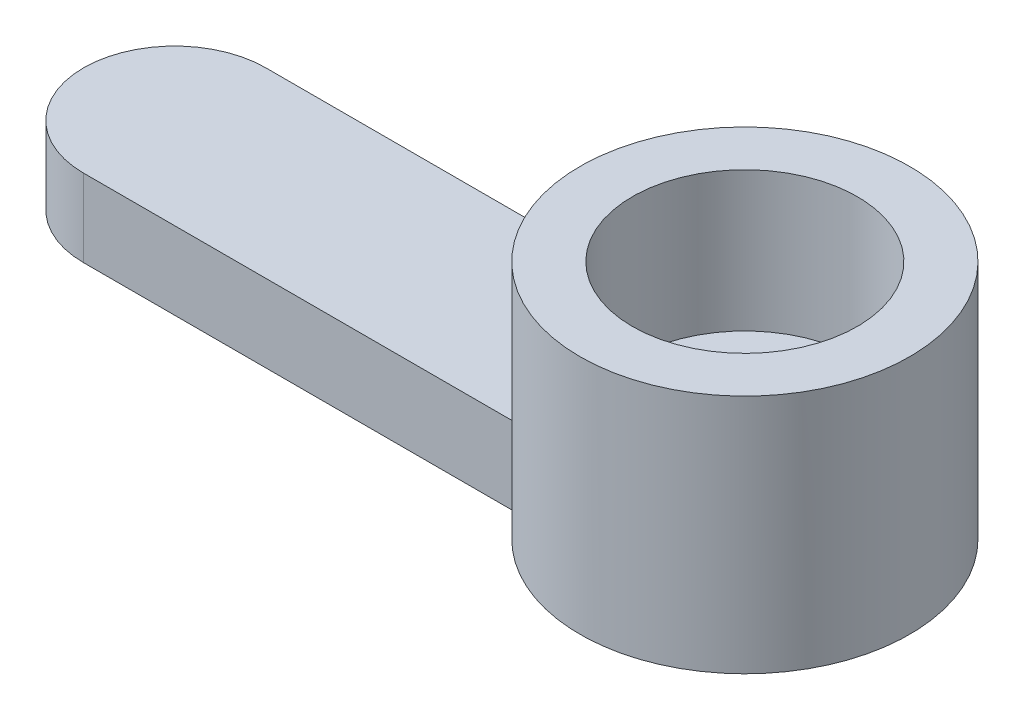
ISO-10303-21;
HEADER;
FILE_DESCRIPTION(('STEP AP214'),'2;1');
FILE_NAME('part.step','',(''),(''),'','','');
FILE_SCHEMA(('AUTOMOTIVE_DESIGN { 1 0 10303 214 1 1 1 1 }'));
ENDSEC;
DATA;
#1=APPLICATION_CONTEXT('core data for automotive mechanical design processes');
#2=APPLICATION_PROTOCOL_DEFINITION('international standard','automotive_design',2000,#1);
#3=PRODUCT_CONTEXT('',#1,'mechanical');
#4=PRODUCT('Part','Part','',(#3));
#5=PRODUCT_RELATED_PRODUCT_CATEGORY('part','',(#4));
#6=PRODUCT_DEFINITION_FORMATION('','',#4);
#7=PRODUCT_DEFINITION_CONTEXT('part definition',#1,'design');
#8=PRODUCT_DEFINITION('design','',#6,#7);
#9=PRODUCT_DEFINITION_SHAPE('','',#8);
#10=(LENGTH_UNIT() NAMED_UNIT(*) SI_UNIT(.MILLI.,.METRE.));
#11=(NAMED_UNIT(*) PLANE_ANGLE_UNIT() SI_UNIT($,.RADIAN.));
#12=(NAMED_UNIT(*) SI_UNIT($,.STERADIAN.) SOLID_ANGLE_UNIT());
#13=UNCERTAINTY_MEASURE_WITH_UNIT(LENGTH_MEASURE(1.E-05),#10,'distance_accuracy_value','');
#14=(GEOMETRIC_REPRESENTATION_CONTEXT(3) GLOBAL_UNCERTAINTY_ASSIGNED_CONTEXT((#13)) GLOBAL_UNIT_ASSIGNED_CONTEXT((#10,
#11,#12)) REPRESENTATION_CONTEXT('',''));
#15=CARTESIAN_POINT('',(0.,0.,0.));
#16=DIRECTION('',(0.,0.,1.));
#17=DIRECTION('',(1.,0.,0.));
#18=AXIS2_PLACEMENT_3D('',#15,#16,#17);
#19=CARTESIAN_POINT('',(0.,3.1,0.));
#20=DIRECTION('',(0.,-1.,0.));
#21=DIRECTION('',(0.,0.,-1.));
#22=AXIS2_PLACEMENT_3D('',#19,#20,#21);
#23=CYLINDRICAL_SURFACE('',#22,2.125);
#24=CARTESIAN_POINT('',(0.,3.1,0.));
#25=DIRECTION('',(0.,1.,0.));
#26=DIRECTION('',(0.,0.,1.));
#27=AXIS2_PLACEMENT_3D('',#24,#25,#26);
#28=CIRCLE('',#27,2.125);
#29=CARTESIAN_POINT('',(0.,3.1,2.125));
#30=VERTEX_POINT('',#29);
#31=EDGE_CURVE('E11',#30,#30,#28,.T.);
#32=ORIENTED_EDGE('',*,*,#31,.F.);
#33=EDGE_LOOP('',(#32));
#34=FACE_BOUND('',#33,.T.);
#35=DIRECTION('',(0.,-1.,0.));
#36=VECTOR('',#35,1.);
#37=CARTESIAN_POINT('',(-1.77059312096258,1.,-1.175));
#38=LINE('',#37,#36);
#39=CARTESIAN_POINT('',(-1.77059312096258,1.,-1.175));
#40=VERTEX_POINT('',#39);
#41=CARTESIAN_POINT('',(-1.77059312096258,0.,-1.175));
#42=VERTEX_POINT('',#41);
#43=EDGE_CURVE('E47',#40,#42,#38,.T.);
#44=ORIENTED_EDGE('',*,*,#43,.F.);
#45=CARTESIAN_POINT('',(0.,1.,0.));
#46=DIRECTION('',(0.,-1.,0.));
#47=DIRECTION('',(0.,0.,-1.));
#48=AXIS2_PLACEMENT_3D('',#45,#46,#47);
#49=CIRCLE('',#48,2.125);
#50=CARTESIAN_POINT('',(-1.77059312096258,1.,1.175));
#51=VERTEX_POINT('',#50);
#52=EDGE_CURVE('E52',#51,#40,#49,.T.);
#53=ORIENTED_EDGE('',*,*,#52,.F.);
#54=DIRECTION('',(0.,-1.,0.));
#55=VECTOR('',#54,1.);
#56=CARTESIAN_POINT('',(-1.77059312096258,1.,1.175));
#57=LINE('',#56,#55);
#58=CARTESIAN_POINT('',(-1.77059312096258,0.,1.175));
#59=VERTEX_POINT('',#58);
#60=EDGE_CURVE('E94',#51,#59,#57,.T.);
#61=ORIENTED_EDGE('',*,*,#60,.T.);
#62=CARTESIAN_POINT('',(0.,0.,0.));
#63=DIRECTION('',(0.,1.,0.));
#64=DIRECTION('',(0.,0.,1.));
#65=AXIS2_PLACEMENT_3D('',#62,#63,#64);
#66=CIRCLE('',#65,2.125);
#67=EDGE_CURVE('E36',#59,#42,#66,.T.);
#68=ORIENTED_EDGE('',*,*,#67,.T.);
#69=EDGE_LOOP('',(#44,#53,#61,#68));
#70=FACE_BOUND('',#69,.T.);
#71=ADVANCED_FACE('F33',(#34,#70),#23,.T.);
#72=CARTESIAN_POINT('',(0.,3.1,0.));
#73=DIRECTION('',(0.,1.,0.));
#74=DIRECTION('',(0.,0.,1.));
#75=AXIS2_PLACEMENT_3D('',#72,#73,#74);
#76=PLANE('',#75);
#77=CARTESIAN_POINT('',(0.,3.1,0.));
#78=DIRECTION('',(0.,1.,0.));
#79=DIRECTION('',(0.,0.,1.));
#80=AXIS2_PLACEMENT_3D('',#77,#78,#79);
#81=CIRCLE('',#80,1.45);
#82=CARTESIAN_POINT('',(0.,3.1,1.45));
#83=VERTEX_POINT('',#82);
#84=EDGE_CURVE('E111',#83,#83,#81,.T.);
#85=ORIENTED_EDGE('',*,*,#84,.F.);
#86=EDGE_LOOP('',(#85));
#87=FACE_BOUND('',#86,.T.);
#88=ORIENTED_EDGE('',*,*,#31,.T.);
#89=EDGE_LOOP('',(#88));
#90=FACE_BOUND('',#89,.T.);
#91=ADVANCED_FACE('F122',(#87,#90),#76,.T.);
#92=CARTESIAN_POINT('',(0.,0.,0.));
#93=DIRECTION('',(0.,1.,0.));
#94=DIRECTION('',(0.,0.,1.));
#95=AXIS2_PLACEMENT_3D('',#92,#93,#94);
#96=PLANE('',#95);
#97=ORIENTED_EDGE('',*,*,#67,.F.);
#98=DIRECTION('',(-1.,0.,0.));
#99=VECTOR('',#98,1.);
#100=CARTESIAN_POINT('',(-1.77059312096258,0.,1.175));
#101=LINE('',#100,#99);
#102=CARTESIAN_POINT('',(-7.35,0.,1.175));
#103=VERTEX_POINT('',#102);
#104=EDGE_CURVE('E101',#59,#103,#101,.T.);
#105=ORIENTED_EDGE('',*,*,#104,.T.);
#106=CARTESIAN_POINT('',(-7.35,0.,0.));
#107=DIRECTION('',(0.,-1.,0.));
#108=DIRECTION('',(0.,0.,-1.));
#109=AXIS2_PLACEMENT_3D('',#106,#107,#108);
#110=CIRCLE('',#109,1.175);
#111=CARTESIAN_POINT('',(-7.35,0.,-1.175));
#112=VERTEX_POINT('',#111);
#113=EDGE_CURVE('E99',#103,#112,#110,.T.);
#114=ORIENTED_EDGE('',*,*,#113,.T.);
#115=DIRECTION('',(-1.,0.,0.));
#116=VECTOR('',#115,1.);
#117=CARTESIAN_POINT('',(-1.77059312096258,0.,-1.175));
#118=LINE('',#117,#116);
#119=EDGE_CURVE('E85',#42,#112,#118,.T.);
#120=ORIENTED_EDGE('',*,*,#119,.F.);
#121=EDGE_LOOP('',(#97,#105,#114,#120));
#122=FACE_BOUND('',#121,.T.);
#123=ADVANCED_FACE('F125',(#122),#96,.F.);
#124=CARTESIAN_POINT('',(0.,1.3,0.));
#125=DIRECTION('',(0.,1.,0.));
#126=DIRECTION('',(0.,0.,1.));
#127=AXIS2_PLACEMENT_3D('',#124,#125,#126);
#128=CYLINDRICAL_SURFACE('',#127,1.45);
#129=CARTESIAN_POINT('',(0.,1.3,0.));
#130=DIRECTION('',(0.,1.,0.));
#131=DIRECTION('',(0.,0.,1.));
#132=AXIS2_PLACEMENT_3D('',#129,#130,#131);
#133=CIRCLE('',#132,1.45);
#134=CARTESIAN_POINT('',(0.,1.3,1.45));
#135=VERTEX_POINT('',#134);
#136=EDGE_CURVE('E114',#135,#135,#133,.T.);
#137=ORIENTED_EDGE('',*,*,#136,.F.);
#138=EDGE_LOOP('',(#137));
#139=FACE_BOUND('',#138,.T.);
#140=ORIENTED_EDGE('',*,*,#84,.T.);
#141=EDGE_LOOP('',(#140));
#142=FACE_BOUND('',#141,.T.);
#143=ADVANCED_FACE('F120',(#139,#142),#128,.F.);
#144=CARTESIAN_POINT('',(0.,1.3,0.));
#145=DIRECTION('',(0.,1.,0.));
#146=DIRECTION('',(0.,0.,1.));
#147=AXIS2_PLACEMENT_3D('',#144,#145,#146);
#148=PLANE('',#147);
#149=CARTESIAN_POINT('',(0.,1.3,0.));
#150=DIRECTION('',(0.,1.,0.));
#151=DIRECTION('',(0.,0.,1.));
#152=AXIS2_PLACEMENT_3D('',#149,#150,#151);
#153=CIRCLE('',#152,0.8);
#154=CARTESIAN_POINT('',(0.,1.3,0.8));
#155=VERTEX_POINT('',#154);
#156=EDGE_CURVE('E107',#155,#155,#153,.T.);
#157=ORIENTED_EDGE('',*,*,#156,.F.);
#158=EDGE_LOOP('',(#157));
#159=FACE_BOUND('',#158,.T.);
#160=ORIENTED_EDGE('',*,*,#136,.T.);
#161=EDGE_LOOP('',(#160));
#162=FACE_BOUND('',#161,.T.);
#163=ADVANCED_FACE('F150',(#159,#162),#148,.T.);
#164=CARTESIAN_POINT('',(0.,0.65,0.));
#165=DIRECTION('',(0.,1.,0.));
#166=DIRECTION('',(0.,0.,1.));
#167=AXIS2_PLACEMENT_3D('',#164,#165,#166);
#168=CYLINDRICAL_SURFACE('',#167,0.8);
#169=CARTESIAN_POINT('',(0.,0.65,0.));
#170=DIRECTION('',(0.,1.,0.));
#171=DIRECTION('',(0.,0.,1.));
#172=AXIS2_PLACEMENT_3D('',#169,#170,#171);
#173=CIRCLE('',#172,0.8);
#174=CARTESIAN_POINT('',(0.,0.65,0.8));
#175=VERTEX_POINT('',#174);
#176=EDGE_CURVE('E108',#175,#175,#173,.T.);
#177=ORIENTED_EDGE('',*,*,#176,.F.);
#178=EDGE_LOOP('',(#177));
#179=FACE_BOUND('',#178,.T.);
#180=ORIENTED_EDGE('',*,*,#156,.T.);
#181=EDGE_LOOP('',(#180));
#182=FACE_BOUND('',#181,.T.);
#183=ADVANCED_FACE('F158',(#179,#182),#168,.F.);
#184=CARTESIAN_POINT('',(0.,0.65,0.));
#185=DIRECTION('',(0.,1.,0.));
#186=DIRECTION('',(0.,0.,1.));
#187=AXIS2_PLACEMENT_3D('',#184,#185,#186);
#188=PLANE('',#187);
#189=ORIENTED_EDGE('',*,*,#176,.T.);
#190=EDGE_LOOP('',(#189));
#191=FACE_BOUND('',#190,.T.);
#192=ADVANCED_FACE('F166',(#191),#188,.T.);
#193=CARTESIAN_POINT('',(-1.77059312096258,1.,-1.175));
#194=DIRECTION('',(0.,0.,1.));
#195=DIRECTION('',(1.,0.,0.));
#196=AXIS2_PLACEMENT_3D('',#193,#194,#195);
#197=PLANE('',#196);
#198=ORIENTED_EDGE('',*,*,#119,.T.);
#199=DIRECTION('',(0.,-1.,0.));
#200=VECTOR('',#199,1.);
#201=CARTESIAN_POINT('',(-7.35,1.,-1.175));
#202=LINE('',#201,#200);
#203=CARTESIAN_POINT('',(-7.35,1.,-1.175));
#204=VERTEX_POINT('',#203);
#205=EDGE_CURVE('E82',#204,#112,#202,.T.);
#206=ORIENTED_EDGE('',*,*,#205,.F.);
#207=DIRECTION('',(-1.,0.,0.));
#208=VECTOR('',#207,1.);
#209=CARTESIAN_POINT('',(-1.77059312096258,1.,-1.175));
#210=LINE('',#209,#208);
#211=EDGE_CURVE('E72',#40,#204,#210,.T.);
#212=ORIENTED_EDGE('',*,*,#211,.F.);
#213=ORIENTED_EDGE('',*,*,#43,.T.);
#214=EDGE_LOOP('',(#198,#206,#212,#213));
#215=FACE_BOUND('',#214,.T.);
#216=ADVANCED_FACE('F83',(#215),#197,.F.);
#217=CARTESIAN_POINT('',(-7.35,1.,0.));
#218=DIRECTION('',(0.,-1.,0.));
#219=DIRECTION('',(0.,0.,-1.));
#220=AXIS2_PLACEMENT_3D('',#217,#218,#219);
#221=CYLINDRICAL_SURFACE('',#220,1.175);
#222=ORIENTED_EDGE('',*,*,#113,.F.);
#223=DIRECTION('',(0.,-1.,0.));
#224=VECTOR('',#223,1.);
#225=CARTESIAN_POINT('',(-7.35,1.,1.175));
#226=LINE('',#225,#224);
#227=CARTESIAN_POINT('',(-7.35,1.,1.175));
#228=VERTEX_POINT('',#227);
#229=EDGE_CURVE('E89',#228,#103,#226,.T.);
#230=ORIENTED_EDGE('',*,*,#229,.F.);
#231=CARTESIAN_POINT('',(-7.35,1.,0.));
#232=DIRECTION('',(0.,-1.,0.));
#233=DIRECTION('',(0.,0.,-1.));
#234=AXIS2_PLACEMENT_3D('',#231,#232,#233);
#235=CIRCLE('',#234,1.175);
#236=EDGE_CURVE('E77',#228,#204,#235,.T.);
#237=ORIENTED_EDGE('',*,*,#236,.T.);
#238=ORIENTED_EDGE('',*,*,#205,.T.);
#239=EDGE_LOOP('',(#222,#230,#237,#238));
#240=FACE_BOUND('',#239,.T.);
#241=ADVANCED_FACE('F91',(#240),#221,.T.);
#242=CARTESIAN_POINT('',(-1.77059312096258,1.,1.175));
#243=DIRECTION('',(0.,0.,1.));
#244=DIRECTION('',(1.,0.,0.));
#245=AXIS2_PLACEMENT_3D('',#242,#243,#244);
#246=PLANE('',#245);
#247=ORIENTED_EDGE('',*,*,#104,.F.);
#248=ORIENTED_EDGE('',*,*,#60,.F.);
#249=DIRECTION('',(-1.,0.,0.));
#250=VECTOR('',#249,1.);
#251=CARTESIAN_POINT('',(-1.77059312096258,1.,1.175));
#252=LINE('',#251,#250);
#253=EDGE_CURVE('E92',#51,#228,#252,.T.);
#254=ORIENTED_EDGE('',*,*,#253,.T.);
#255=ORIENTED_EDGE('',*,*,#229,.T.);
#256=EDGE_LOOP('',(#247,#248,#254,#255));
#257=FACE_BOUND('',#256,.T.);
#258=ADVANCED_FACE('F185',(#257),#246,.T.);
#259=CARTESIAN_POINT('',(0.,1.,0.));
#260=DIRECTION('',(0.,-1.,0.));
#261=DIRECTION('',(0.,0.,-1.));
#262=AXIS2_PLACEMENT_3D('',#259,#260,#261);
#263=PLANE('',#262);
#264=ORIENTED_EDGE('',*,*,#52,.T.);
#265=ORIENTED_EDGE('',*,*,#211,.T.);
#266=ORIENTED_EDGE('',*,*,#236,.F.);
#267=ORIENTED_EDGE('',*,*,#253,.F.);
#268=EDGE_LOOP('',(#264,#265,#266,#267));
#269=FACE_BOUND('',#268,.T.);
#270=ADVANCED_FACE('F74',(#269),#263,.F.);
#271=CLOSED_SHELL('',(#71,#91,#123,#143,#163,#183,#192,#216,#241,#258,#270));
#272=MANIFOLD_SOLID_BREP('B2',#271);
#273=ADVANCED_BREP_SHAPE_REPRESENTATION('',(#18,#272),#14);
#274=SHAPE_DEFINITION_REPRESENTATION(#9,#273);
ENDSEC;
END-ISO-10303-21;
